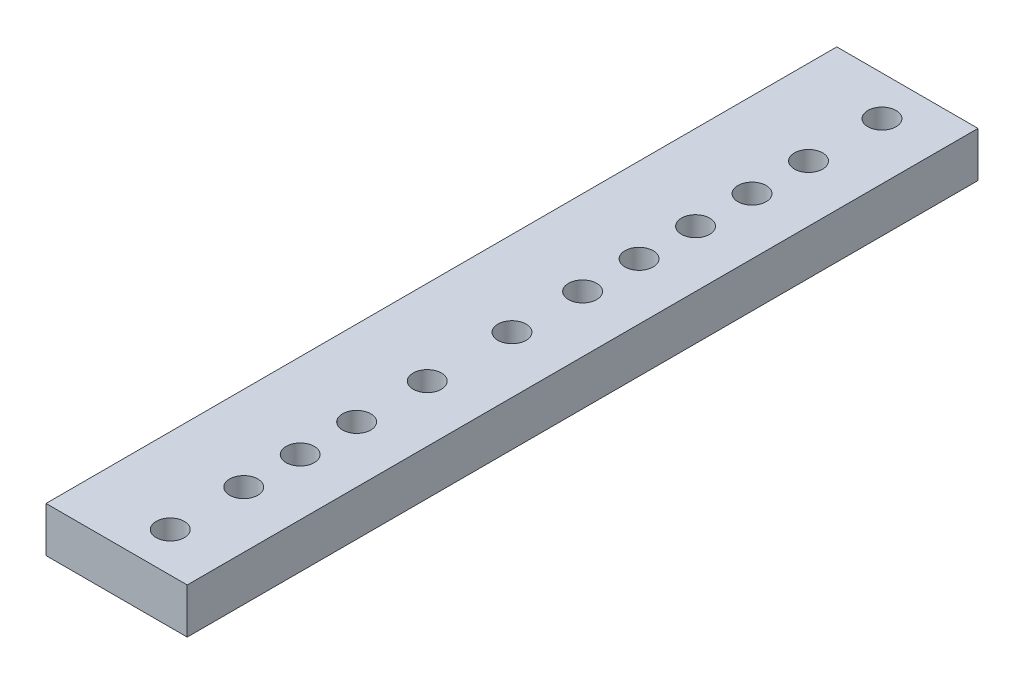
ISO-10303-21;
HEADER;
FILE_DESCRIPTION(('STEP AP214'),'2;1');
FILE_NAME('part.step','',(''),(''),'','','');
FILE_SCHEMA(('AUTOMOTIVE_DESIGN { 1 0 10303 214 1 1 1 1 }'));
ENDSEC;
DATA;
#1=APPLICATION_CONTEXT('core data for automotive mechanical design processes');
#2=APPLICATION_PROTOCOL_DEFINITION('international standard','automotive_design',2000,#1);
#3=PRODUCT_CONTEXT('',#1,'mechanical');
#4=PRODUCT('Part','Part','',(#3));
#5=PRODUCT_RELATED_PRODUCT_CATEGORY('part','',(#4));
#6=PRODUCT_DEFINITION_FORMATION('','',#4);
#7=PRODUCT_DEFINITION_CONTEXT('part definition',#1,'design');
#8=PRODUCT_DEFINITION('design','',#6,#7);
#9=PRODUCT_DEFINITION_SHAPE('','',#8);
#10=(LENGTH_UNIT() NAMED_UNIT(*) SI_UNIT(.MILLI.,.METRE.));
#11=(NAMED_UNIT(*) PLANE_ANGLE_UNIT() SI_UNIT($,.RADIAN.));
#12=(NAMED_UNIT(*) SI_UNIT($,.STERADIAN.) SOLID_ANGLE_UNIT());
#13=UNCERTAINTY_MEASURE_WITH_UNIT(LENGTH_MEASURE(1.E-05),#10,'distance_accuracy_value','');
#14=(GEOMETRIC_REPRESENTATION_CONTEXT(3) GLOBAL_UNCERTAINTY_ASSIGNED_CONTEXT((#13)) GLOBAL_UNIT_ASSIGNED_CONTEXT((#10,
#11,#12)) REPRESENTATION_CONTEXT('',''));
#15=CARTESIAN_POINT('',(0.,0.,0.));
#16=DIRECTION('',(0.,0.,1.));
#17=DIRECTION('',(1.,0.,0.));
#18=AXIS2_PLACEMENT_3D('',#15,#16,#17);
#19=CARTESIAN_POINT('',(0.,8.,0.));
#20=DIRECTION('',(1.,0.,0.));
#21=DIRECTION('',(0.,0.,-1.));
#22=AXIS2_PLACEMENT_3D('',#19,#20,#21);
#23=PLANE('',#22);
#24=DIRECTION('',(0.,0.,1.));
#25=VECTOR('',#24,1.);
#26=CARTESIAN_POINT('',(0.,0.,0.));
#27=LINE('',#26,#25);
#28=CARTESIAN_POINT('',(0.,0.,-140.));
#29=VERTEX_POINT('',#28);
#30=CARTESIAN_POINT('',(0.,0.,0.));
#31=VERTEX_POINT('',#30);
#32=EDGE_CURVE('E100',#29,#31,#27,.T.);
#33=ORIENTED_EDGE('',*,*,#32,.T.);
#34=DIRECTION('',(0.,-1.,0.));
#35=VECTOR('',#34,1.);
#36=CARTESIAN_POINT('',(0.,8.,0.));
#37=LINE('',#36,#35);
#38=CARTESIAN_POINT('',(0.,8.,0.));
#39=VERTEX_POINT('',#38);
#40=EDGE_CURVE('E11',#39,#31,#37,.T.);
#41=ORIENTED_EDGE('',*,*,#40,.F.);
#42=DIRECTION('',(0.,0.,1.));
#43=VECTOR('',#42,1.);
#44=CARTESIAN_POINT('',(0.,8.,0.));
#45=LINE('',#44,#43);
#46=CARTESIAN_POINT('',(0.,8.,-140.));
#47=VERTEX_POINT('',#46);
#48=EDGE_CURVE('E88',#47,#39,#45,.T.);
#49=ORIENTED_EDGE('',*,*,#48,.F.);
#50=DIRECTION('',(0.,-1.,0.));
#51=VECTOR('',#50,1.);
#52=CARTESIAN_POINT('',(0.,8.,-140.));
#53=LINE('',#52,#51);
#54=EDGE_CURVE('E96',#47,#29,#53,.T.);
#55=ORIENTED_EDGE('',*,*,#54,.T.);
#56=EDGE_LOOP('',(#33,#41,#49,#55));
#57=FACE_BOUND('',#56,.T.);
#58=ADVANCED_FACE('F37',(#57),#23,.F.);
#59=CARTESIAN_POINT('',(0.,8.,0.));
#60=DIRECTION('',(0.,0.,-1.));
#61=DIRECTION('',(-1.,0.,0.));
#62=AXIS2_PLACEMENT_3D('',#59,#60,#61);
#63=PLANE('',#62);
#64=DIRECTION('',(1.,0.,0.));
#65=VECTOR('',#64,1.);
#66=CARTESIAN_POINT('',(0.,0.,0.));
#67=LINE('',#66,#65);
#68=CARTESIAN_POINT('',(25.,0.,0.));
#69=VERTEX_POINT('',#68);
#70=EDGE_CURVE('E92',#31,#69,#67,.T.);
#71=ORIENTED_EDGE('',*,*,#70,.T.);
#72=DIRECTION('',(0.,-1.,0.));
#73=VECTOR('',#72,1.);
#74=CARTESIAN_POINT('',(25.,8.,0.));
#75=LINE('',#74,#73);
#76=CARTESIAN_POINT('',(25.,8.,0.));
#77=VERTEX_POINT('',#76);
#78=EDGE_CURVE('E45',#77,#69,#75,.T.);
#79=ORIENTED_EDGE('',*,*,#78,.F.);
#80=DIRECTION('',(1.,0.,0.));
#81=VECTOR('',#80,1.);
#82=CARTESIAN_POINT('',(0.,8.,0.));
#83=LINE('',#82,#81);
#84=EDGE_CURVE('E83',#39,#77,#83,.T.);
#85=ORIENTED_EDGE('',*,*,#84,.F.);
#86=ORIENTED_EDGE('',*,*,#40,.T.);
#87=EDGE_LOOP('',(#71,#79,#85,#86));
#88=FACE_BOUND('',#87,.T.);
#89=ADVANCED_FACE('F91',(#88),#63,.F.);
#90=CARTESIAN_POINT('',(25.,8.,0.));
#91=DIRECTION('',(-1.,0.,0.));
#92=DIRECTION('',(0.,0.,1.));
#93=AXIS2_PLACEMENT_3D('',#90,#91,#92);
#94=PLANE('',#93);
#95=DIRECTION('',(0.,0.,-1.));
#96=VECTOR('',#95,1.);
#97=CARTESIAN_POINT('',(25.,0.,0.));
#98=LINE('',#97,#96);
#99=CARTESIAN_POINT('',(25.,0.,-140.));
#100=VERTEX_POINT('',#99);
#101=EDGE_CURVE('E70',#69,#100,#98,.T.);
#102=ORIENTED_EDGE('',*,*,#101,.T.);
#103=DIRECTION('',(0.,-1.,0.));
#104=VECTOR('',#103,1.);
#105=CARTESIAN_POINT('',(25.,8.,-140.));
#106=LINE('',#105,#104);
#107=CARTESIAN_POINT('',(25.,8.,-140.));
#108=VERTEX_POINT('',#107);
#109=EDGE_CURVE('E93',#108,#100,#106,.T.);
#110=ORIENTED_EDGE('',*,*,#109,.F.);
#111=DIRECTION('',(0.,0.,-1.));
#112=VECTOR('',#111,1.);
#113=CARTESIAN_POINT('',(25.,8.,0.));
#114=LINE('',#113,#112);
#115=EDGE_CURVE('E86',#77,#108,#114,.T.);
#116=ORIENTED_EDGE('',*,*,#115,.F.);
#117=ORIENTED_EDGE('',*,*,#78,.T.);
#118=EDGE_LOOP('',(#102,#110,#116,#117));
#119=FACE_BOUND('',#118,.T.);
#120=ADVANCED_FACE('F94',(#119),#94,.F.);
#121=CARTESIAN_POINT('',(0.,8.,-140.));
#122=DIRECTION('',(0.,0.,1.));
#123=DIRECTION('',(1.,0.,0.));
#124=AXIS2_PLACEMENT_3D('',#121,#122,#123);
#125=PLANE('',#124);
#126=DIRECTION('',(-1.,0.,0.));
#127=VECTOR('',#126,1.);
#128=CARTESIAN_POINT('',(0.,0.,-140.));
#129=LINE('',#128,#127);
#130=EDGE_CURVE('E76',#100,#29,#129,.T.);
#131=ORIENTED_EDGE('',*,*,#130,.T.);
#132=ORIENTED_EDGE('',*,*,#54,.F.);
#133=DIRECTION('',(-1.,0.,0.));
#134=VECTOR('',#133,1.);
#135=CARTESIAN_POINT('',(0.,8.,-140.));
#136=LINE('',#135,#134);
#137=EDGE_CURVE('E53',#108,#47,#136,.T.);
#138=ORIENTED_EDGE('',*,*,#137,.F.);
#139=ORIENTED_EDGE('',*,*,#109,.T.);
#140=EDGE_LOOP('',(#131,#132,#138,#139));
#141=FACE_BOUND('',#140,.T.);
#142=ADVANCED_FACE('F108',(#141),#125,.F.);
#143=CARTESIAN_POINT('',(0.,8.,0.));
#144=DIRECTION('',(0.,-1.,0.));
#145=DIRECTION('',(0.,0.,-1.));
#146=AXIS2_PLACEMENT_3D('',#143,#144,#145);
#147=PLANE('',#146);
#148=CARTESIAN_POINT('',(14.998416969425,8.,-67.4999999164671));
#149=DIRECTION('',(0.,-1.,0.));
#150=DIRECTION('',(0.,0.,-1.));
#151=AXIS2_PLACEMENT_3D('',#148,#149,#150);
#152=CIRCLE('',#151,2.5);
#153=CARTESIAN_POINT('',(14.998416969425,8.,-69.9999999164671));
#154=VERTEX_POINT('',#153);
#155=EDGE_CURVE('E118',#154,#154,#152,.T.);
#156=ORIENTED_EDGE('',*,*,#155,.T.);
#157=EDGE_LOOP('',(#156));
#158=FACE_BOUND('',#157,.T.);
#159=CARTESIAN_POINT('',(14.997923513951,8.,-79.9999999067272));
#160=DIRECTION('',(0.,-1.,0.));
#161=DIRECTION('',(0.,0.,-1.));
#162=AXIS2_PLACEMENT_3D('',#159,#160,#161);
#163=CIRCLE('',#162,2.5);
#164=CARTESIAN_POINT('',(14.997923513951,8.,-82.4999999067272));
#165=VERTEX_POINT('',#164);
#166=EDGE_CURVE('E177',#165,#165,#163,.T.);
#167=ORIENTED_EDGE('',*,*,#166,.T.);
#168=EDGE_LOOP('',(#167));
#169=FACE_BOUND('',#168,.T.);
#170=CARTESIAN_POINT('',(14.9976450619615,8.,-89.9999999028504));
#171=DIRECTION('',(0.,-1.,0.));
#172=DIRECTION('',(0.,0.,-1.));
#173=AXIS2_PLACEMENT_3D('',#170,#171,#172);
#174=CIRCLE('',#173,2.5);
#175=CARTESIAN_POINT('',(14.9976450619615,8.,-92.4999999028504));
#176=VERTEX_POINT('',#175);
#177=EDGE_CURVE('E171',#176,#176,#174,.T.);
#178=ORIENTED_EDGE('',*,*,#177,.T.);
#179=EDGE_LOOP('',(#178));
#180=FACE_BOUND('',#179,.T.);
#181=CARTESIAN_POINT('',(14.9974952215144,8.,-99.9999999017278));
#182=DIRECTION('',(0.,-1.,0.));
#183=DIRECTION('',(0.,0.,-1.));
#184=AXIS2_PLACEMENT_3D('',#181,#182,#183);
#185=CIRCLE('',#184,2.5);
#186=CARTESIAN_POINT('',(14.9974952215144,8.,-102.499999901728));
#187=VERTEX_POINT('',#186);
#188=EDGE_CURVE('E165',#187,#187,#185,.T.);
#189=ORIENTED_EDGE('',*,*,#188,.T.);
#190=EDGE_LOOP('',(#189));
#191=FACE_BOUND('',#190,.T.);
#192=CARTESIAN_POINT('',(14.9973935200754,8.,-109.999999901211));
#193=DIRECTION('',(0.,-1.,0.));
#194=DIRECTION('',(0.,0.,-1.));
#195=AXIS2_PLACEMENT_3D('',#192,#193,#194);
#196=CIRCLE('',#195,2.5);
#197=CARTESIAN_POINT('',(14.9973935200754,8.,-112.499999901211));
#198=VERTEX_POINT('',#197);
#199=EDGE_CURVE('E159',#198,#198,#196,.T.);
#200=ORIENTED_EDGE('',*,*,#199,.T.);
#201=EDGE_LOOP('',(#200));
#202=FACE_BOUND('',#201,.T.);
#203=CARTESIAN_POINT('',(14.9973278386523,8.,-119.999999900995));
#204=DIRECTION('',(0.,-1.,0.));
#205=DIRECTION('',(0.,0.,-1.));
#206=AXIS2_PLACEMENT_3D('',#203,#204,#205);
#207=CIRCLE('',#206,2.5);
#208=CARTESIAN_POINT('',(14.9973278386523,8.,-122.499999900995));
#209=VERTEX_POINT('',#208);
#210=EDGE_CURVE('E153',#209,#209,#207,.T.);
#211=ORIENTED_EDGE('',*,*,#210,.T.);
#212=EDGE_LOOP('',(#211));
#213=FACE_BOUND('',#212,.T.);
#214=CARTESIAN_POINT('',(14.9972704033617,8.,-132.999999900868));
#215=DIRECTION('',(0.,-1.,0.));
#216=DIRECTION('',(0.,0.,-1.));
#217=AXIS2_PLACEMENT_3D('',#214,#215,#216);
#218=CIRCLE('',#217,2.5);
#219=CARTESIAN_POINT('',(14.9972704033617,8.,-135.499999900868));
#220=VERTEX_POINT('',#219);
#221=EDGE_CURVE('E147',#220,#220,#218,.T.);
#222=ORIENTED_EDGE('',*,*,#221,.T.);
#223=EDGE_LOOP('',(#222));
#224=FACE_BOUND('',#223,.T.);
#225=CARTESIAN_POINT('',(15.,8.,-7.00000000000001));
#226=DIRECTION('',(0.,1.,0.));
#227=DIRECTION('',(0.,0.,1.));
#228=AXIS2_PLACEMENT_3D('',#225,#226,#227);
#229=CIRCLE('',#228,2.5);
#230=CARTESIAN_POINT('',(15.,8.,-4.50000000000001));
#231=VERTEX_POINT('',#230);
#232=EDGE_CURVE('E139',#231,#231,#229,.T.);
#233=ORIENTED_EDGE('',*,*,#232,.F.);
#234=EDGE_LOOP('',(#233));
#235=FACE_BOUND('',#234,.T.);
#236=CARTESIAN_POINT('',(15.,8.,-20.));
#237=DIRECTION('',(0.,1.,0.));
#238=DIRECTION('',(0.,0.,1.));
#239=AXIS2_PLACEMENT_3D('',#236,#237,#238);
#240=CIRCLE('',#239,2.5);
#241=CARTESIAN_POINT('',(15.,8.,-17.5));
#242=VERTEX_POINT('',#241);
#243=EDGE_CURVE('E133',#242,#242,#240,.T.);
#244=ORIENTED_EDGE('',*,*,#243,.F.);
#245=EDGE_LOOP('',(#244));
#246=FACE_BOUND('',#245,.T.);
#247=CARTESIAN_POINT('',(15.,8.,-30.));
#248=DIRECTION('',(0.,1.,0.));
#249=DIRECTION('',(0.,0.,1.));
#250=AXIS2_PLACEMENT_3D('',#247,#248,#249);
#251=CIRCLE('',#250,2.5);
#252=CARTESIAN_POINT('',(15.,8.,-27.5));
#253=VERTEX_POINT('',#252);
#254=EDGE_CURVE('E127',#253,#253,#251,.T.);
#255=ORIENTED_EDGE('',*,*,#254,.F.);
#256=EDGE_LOOP('',(#255));
#257=FACE_BOUND('',#256,.T.);
#258=CARTESIAN_POINT('',(15.,8.,-40.));
#259=DIRECTION('',(0.,1.,0.));
#260=DIRECTION('',(0.,0.,1.));
#261=AXIS2_PLACEMENT_3D('',#258,#259,#260);
#262=CIRCLE('',#261,2.5);
#263=CARTESIAN_POINT('',(15.,8.,-37.5));
#264=VERTEX_POINT('',#263);
#265=EDGE_CURVE('E121',#264,#264,#262,.T.);
#266=ORIENTED_EDGE('',*,*,#265,.F.);
#267=EDGE_LOOP('',(#266));
#268=FACE_BOUND('',#267,.T.);
#269=CARTESIAN_POINT('',(15.,8.,-52.5));
#270=DIRECTION('',(0.,1.,0.));
#271=DIRECTION('',(0.,0.,1.));
#272=AXIS2_PLACEMENT_3D('',#269,#270,#271);
#273=CIRCLE('',#272,2.5);
#274=CARTESIAN_POINT('',(15.,8.,-50.));
#275=VERTEX_POINT('',#274);
#276=EDGE_CURVE('E114',#275,#275,#273,.T.);
#277=ORIENTED_EDGE('',*,*,#276,.F.);
#278=EDGE_LOOP('',(#277));
#279=FACE_BOUND('',#278,.T.);
#280=ORIENTED_EDGE('',*,*,#48,.T.);
#281=ORIENTED_EDGE('',*,*,#84,.T.);
#282=ORIENTED_EDGE('',*,*,#115,.T.);
#283=ORIENTED_EDGE('',*,*,#137,.T.);
#284=EDGE_LOOP('',(#280,#281,#282,#283));
#285=FACE_BOUND('',#284,.T.);
#286=ADVANCED_FACE('F84',(#158,#169,#180,#191,#202,#213,#224,#235,#246,#257,#268,#279,#285),
#147,.F.);
#287=CARTESIAN_POINT('',(0.,0.,0.));
#288=DIRECTION('',(0.,-1.,0.));
#289=DIRECTION('',(0.,0.,-1.));
#290=AXIS2_PLACEMENT_3D('',#287,#288,#289);
#291=PLANE('',#290);
#292=CARTESIAN_POINT('',(14.998416969425,0.,-67.4999999164671));
#293=DIRECTION('',(0.,-1.,0.));
#294=DIRECTION('',(0.,0.,-1.));
#295=AXIS2_PLACEMENT_3D('',#292,#293,#294);
#296=CIRCLE('',#295,2.5);
#297=CARTESIAN_POINT('',(14.998416969425,0.,-69.9999999164671));
#298=VERTEX_POINT('',#297);
#299=EDGE_CURVE('E180',#298,#298,#296,.T.);
#300=ORIENTED_EDGE('',*,*,#299,.F.);
#301=EDGE_LOOP('',(#300));
#302=FACE_BOUND('',#301,.T.);
#303=CARTESIAN_POINT('',(14.997923513951,0.,-79.9999999067272));
#304=DIRECTION('',(0.,-1.,0.));
#305=DIRECTION('',(0.,0.,-1.));
#306=AXIS2_PLACEMENT_3D('',#303,#304,#305);
#307=CIRCLE('',#306,2.5);
#308=CARTESIAN_POINT('',(14.997923513951,0.,-82.4999999067272));
#309=VERTEX_POINT('',#308);
#310=EDGE_CURVE('E174',#309,#309,#307,.T.);
#311=ORIENTED_EDGE('',*,*,#310,.F.);
#312=EDGE_LOOP('',(#311));
#313=FACE_BOUND('',#312,.T.);
#314=CARTESIAN_POINT('',(14.9976450619615,0.,-89.9999999028504));
#315=DIRECTION('',(0.,-1.,0.));
#316=DIRECTION('',(0.,0.,-1.));
#317=AXIS2_PLACEMENT_3D('',#314,#315,#316);
#318=CIRCLE('',#317,2.5);
#319=CARTESIAN_POINT('',(14.9976450619615,0.,-92.4999999028504));
#320=VERTEX_POINT('',#319);
#321=EDGE_CURVE('E168',#320,#320,#318,.T.);
#322=ORIENTED_EDGE('',*,*,#321,.F.);
#323=EDGE_LOOP('',(#322));
#324=FACE_BOUND('',#323,.T.);
#325=CARTESIAN_POINT('',(14.9974952215144,0.,-99.9999999017278));
#326=DIRECTION('',(0.,-1.,0.));
#327=DIRECTION('',(0.,0.,-1.));
#328=AXIS2_PLACEMENT_3D('',#325,#326,#327);
#329=CIRCLE('',#328,2.5);
#330=CARTESIAN_POINT('',(14.9974952215144,0.,-102.499999901728));
#331=VERTEX_POINT('',#330);
#332=EDGE_CURVE('E162',#331,#331,#329,.T.);
#333=ORIENTED_EDGE('',*,*,#332,.F.);
#334=EDGE_LOOP('',(#333));
#335=FACE_BOUND('',#334,.T.);
#336=CARTESIAN_POINT('',(14.9973935200754,0.,-109.999999901211));
#337=DIRECTION('',(0.,-1.,0.));
#338=DIRECTION('',(0.,0.,-1.));
#339=AXIS2_PLACEMENT_3D('',#336,#337,#338);
#340=CIRCLE('',#339,2.5);
#341=CARTESIAN_POINT('',(14.9973935200754,0.,-112.499999901211));
#342=VERTEX_POINT('',#341);
#343=EDGE_CURVE('E156',#342,#342,#340,.T.);
#344=ORIENTED_EDGE('',*,*,#343,.F.);
#345=EDGE_LOOP('',(#344));
#346=FACE_BOUND('',#345,.T.);
#347=CARTESIAN_POINT('',(14.9973278386523,0.,-119.999999900995));
#348=DIRECTION('',(0.,-1.,0.));
#349=DIRECTION('',(0.,0.,-1.));
#350=AXIS2_PLACEMENT_3D('',#347,#348,#349);
#351=CIRCLE('',#350,2.5);
#352=CARTESIAN_POINT('',(14.9973278386523,0.,-122.499999900995));
#353=VERTEX_POINT('',#352);
#354=EDGE_CURVE('E150',#353,#353,#351,.T.);
#355=ORIENTED_EDGE('',*,*,#354,.F.);
#356=EDGE_LOOP('',(#355));
#357=FACE_BOUND('',#356,.T.);
#358=CARTESIAN_POINT('',(14.9972704033617,0.,-132.999999900868));
#359=DIRECTION('',(0.,-1.,0.));
#360=DIRECTION('',(0.,0.,-1.));
#361=AXIS2_PLACEMENT_3D('',#358,#359,#360);
#362=CIRCLE('',#361,2.5);
#363=CARTESIAN_POINT('',(14.9972704033617,0.,-135.499999900868));
#364=VERTEX_POINT('',#363);
#365=EDGE_CURVE('E144',#364,#364,#362,.T.);
#366=ORIENTED_EDGE('',*,*,#365,.F.);
#367=EDGE_LOOP('',(#366));
#368=FACE_BOUND('',#367,.T.);
#369=CARTESIAN_POINT('',(15.,0.,-7.00000000000001));
#370=DIRECTION('',(0.,1.,0.));
#371=DIRECTION('',(0.,0.,1.));
#372=AXIS2_PLACEMENT_3D('',#369,#370,#371);
#373=CIRCLE('',#372,2.5);
#374=CARTESIAN_POINT('',(15.,0.,-4.50000000000001));
#375=VERTEX_POINT('',#374);
#376=EDGE_CURVE('E103',#375,#375,#373,.T.);
#377=ORIENTED_EDGE('',*,*,#376,.T.);
#378=EDGE_LOOP('',(#377));
#379=FACE_BOUND('',#378,.T.);
#380=CARTESIAN_POINT('',(15.,0.,-20.));
#381=DIRECTION('',(0.,1.,0.));
#382=DIRECTION('',(0.,0.,1.));
#383=AXIS2_PLACEMENT_3D('',#380,#381,#382);
#384=CIRCLE('',#383,2.5);
#385=CARTESIAN_POINT('',(15.,0.,-17.5));
#386=VERTEX_POINT('',#385);
#387=EDGE_CURVE('E136',#386,#386,#384,.T.);
#388=ORIENTED_EDGE('',*,*,#387,.T.);
#389=EDGE_LOOP('',(#388));
#390=FACE_BOUND('',#389,.T.);
#391=CARTESIAN_POINT('',(15.,0.,-30.));
#392=DIRECTION('',(0.,1.,0.));
#393=DIRECTION('',(0.,0.,1.));
#394=AXIS2_PLACEMENT_3D('',#391,#392,#393);
#395=CIRCLE('',#394,2.5);
#396=CARTESIAN_POINT('',(15.,0.,-27.5));
#397=VERTEX_POINT('',#396);
#398=EDGE_CURVE('E130',#397,#397,#395,.T.);
#399=ORIENTED_EDGE('',*,*,#398,.T.);
#400=EDGE_LOOP('',(#399));
#401=FACE_BOUND('',#400,.T.);
#402=CARTESIAN_POINT('',(15.,0.,-40.));
#403=DIRECTION('',(0.,1.,0.));
#404=DIRECTION('',(0.,0.,1.));
#405=AXIS2_PLACEMENT_3D('',#402,#403,#404);
#406=CIRCLE('',#405,2.5);
#407=CARTESIAN_POINT('',(15.,0.,-37.5));
#408=VERTEX_POINT('',#407);
#409=EDGE_CURVE('E124',#408,#408,#406,.T.);
#410=ORIENTED_EDGE('',*,*,#409,.T.);
#411=EDGE_LOOP('',(#410));
#412=FACE_BOUND('',#411,.T.);
#413=CARTESIAN_POINT('',(15.,0.,-52.5));
#414=DIRECTION('',(0.,1.,0.));
#415=DIRECTION('',(0.,0.,1.));
#416=AXIS2_PLACEMENT_3D('',#413,#414,#415);
#417=CIRCLE('',#416,2.5);
#418=CARTESIAN_POINT('',(15.,0.,-50.));
#419=VERTEX_POINT('',#418);
#420=EDGE_CURVE('E117',#419,#419,#417,.T.);
#421=ORIENTED_EDGE('',*,*,#420,.T.);
#422=EDGE_LOOP('',(#421));
#423=FACE_BOUND('',#422,.T.);
#424=ORIENTED_EDGE('',*,*,#32,.F.);
#425=ORIENTED_EDGE('',*,*,#130,.F.);
#426=ORIENTED_EDGE('',*,*,#101,.F.);
#427=ORIENTED_EDGE('',*,*,#70,.F.);
#428=EDGE_LOOP('',(#424,#425,#426,#427));
#429=FACE_BOUND('',#428,.T.);
#430=ADVANCED_FACE('F111',(#302,#313,#324,#335,#346,#357,#368,#379,#390,#401,#412,#423,#429),
#291,.T.);
#431=CARTESIAN_POINT('',(15.,0.,-52.5));
#432=DIRECTION('',(0.,1.,0.));
#433=DIRECTION('',(0.,0.,1.));
#434=AXIS2_PLACEMENT_3D('',#431,#432,#433);
#435=CYLINDRICAL_SURFACE('',#434,2.5);
#436=ORIENTED_EDGE('',*,*,#420,.F.);
#437=EDGE_LOOP('',(#436));
#438=FACE_BOUND('',#437,.T.);
#439=ORIENTED_EDGE('',*,*,#276,.T.);
#440=EDGE_LOOP('',(#439));
#441=FACE_BOUND('',#440,.T.);
#442=ADVANCED_FACE('F197',(#438,#441),#435,.F.);
#443=CARTESIAN_POINT('',(15.,0.,-40.));
#444=DIRECTION('',(0.,1.,0.));
#445=DIRECTION('',(0.,0.,1.));
#446=AXIS2_PLACEMENT_3D('',#443,#444,#445);
#447=CYLINDRICAL_SURFACE('',#446,2.5);
#448=ORIENTED_EDGE('',*,*,#409,.F.);
#449=EDGE_LOOP('',(#448));
#450=FACE_BOUND('',#449,.T.);
#451=ORIENTED_EDGE('',*,*,#265,.T.);
#452=EDGE_LOOP('',(#451));
#453=FACE_BOUND('',#452,.T.);
#454=ADVANCED_FACE('F223',(#450,#453),#447,.F.);
#455=CARTESIAN_POINT('',(15.,0.,-30.));
#456=DIRECTION('',(0.,1.,0.));
#457=DIRECTION('',(0.,0.,1.));
#458=AXIS2_PLACEMENT_3D('',#455,#456,#457);
#459=CYLINDRICAL_SURFACE('',#458,2.5);
#460=ORIENTED_EDGE('',*,*,#398,.F.);
#461=EDGE_LOOP('',(#460));
#462=FACE_BOUND('',#461,.T.);
#463=ORIENTED_EDGE('',*,*,#254,.T.);
#464=EDGE_LOOP('',(#463));
#465=FACE_BOUND('',#464,.T.);
#466=ADVANCED_FACE('F264',(#462,#465),#459,.F.);
#467=CARTESIAN_POINT('',(15.,0.,-20.));
#468=DIRECTION('',(0.,1.,0.));
#469=DIRECTION('',(0.,0.,1.));
#470=AXIS2_PLACEMENT_3D('',#467,#468,#469);
#471=CYLINDRICAL_SURFACE('',#470,2.5);
#472=ORIENTED_EDGE('',*,*,#387,.F.);
#473=EDGE_LOOP('',(#472));
#474=FACE_BOUND('',#473,.T.);
#475=ORIENTED_EDGE('',*,*,#243,.T.);
#476=EDGE_LOOP('',(#475));
#477=FACE_BOUND('',#476,.T.);
#478=ADVANCED_FACE('F274',(#474,#477),#471,.F.);
#479=CARTESIAN_POINT('',(15.,0.,-7.00000000000001));
#480=DIRECTION('',(0.,1.,0.));
#481=DIRECTION('',(0.,0.,1.));
#482=AXIS2_PLACEMENT_3D('',#479,#480,#481);
#483=CYLINDRICAL_SURFACE('',#482,2.5);
#484=ORIENTED_EDGE('',*,*,#376,.F.);
#485=EDGE_LOOP('',(#484));
#486=FACE_BOUND('',#485,.T.);
#487=ORIENTED_EDGE('',*,*,#232,.T.);
#488=EDGE_LOOP('',(#487));
#489=FACE_BOUND('',#488,.T.);
#490=ADVANCED_FACE('F284',(#486,#489),#483,.F.);
#491=CARTESIAN_POINT('',(14.9972704033617,8.,-132.999999900868));
#492=DIRECTION('',(0.,-1.,0.));
#493=DIRECTION('',(0.,0.,-1.));
#494=AXIS2_PLACEMENT_3D('',#491,#492,#493);
#495=CYLINDRICAL_SURFACE('',#494,2.5);
#496=ORIENTED_EDGE('',*,*,#221,.F.);
#497=EDGE_LOOP('',(#496));
#498=FACE_BOUND('',#497,.T.);
#499=ORIENTED_EDGE('',*,*,#365,.T.);
#500=EDGE_LOOP('',(#499));
#501=FACE_BOUND('',#500,.T.);
#502=ADVANCED_FACE('F293',(#498,#501),#495,.F.);
#503=CARTESIAN_POINT('',(14.9973278386523,8.,-119.999999900995));
#504=DIRECTION('',(0.,-1.,0.));
#505=DIRECTION('',(0.,0.,-1.));
#506=AXIS2_PLACEMENT_3D('',#503,#504,#505);
#507=CYLINDRICAL_SURFACE('',#506,2.5);
#508=ORIENTED_EDGE('',*,*,#210,.F.);
#509=EDGE_LOOP('',(#508));
#510=FACE_BOUND('',#509,.T.);
#511=ORIENTED_EDGE('',*,*,#354,.T.);
#512=EDGE_LOOP('',(#511));
#513=FACE_BOUND('',#512,.T.);
#514=ADVANCED_FACE('F312',(#510,#513),#507,.F.);
#515=CARTESIAN_POINT('',(14.9973935200754,8.,-109.999999901211));
#516=DIRECTION('',(0.,-1.,0.));
#517=DIRECTION('',(0.,0.,-1.));
#518=AXIS2_PLACEMENT_3D('',#515,#516,#517);
#519=CYLINDRICAL_SURFACE('',#518,2.5);
#520=ORIENTED_EDGE('',*,*,#199,.F.);
#521=EDGE_LOOP('',(#520));
#522=FACE_BOUND('',#521,.T.);
#523=ORIENTED_EDGE('',*,*,#343,.T.);
#524=EDGE_LOOP('',(#523));
#525=FACE_BOUND('',#524,.T.);
#526=ADVANCED_FACE('F322',(#522,#525),#519,.F.);
#527=CARTESIAN_POINT('',(14.9974952215144,8.,-99.9999999017278));
#528=DIRECTION('',(0.,-1.,0.));
#529=DIRECTION('',(0.,0.,-1.));
#530=AXIS2_PLACEMENT_3D('',#527,#528,#529);
#531=CYLINDRICAL_SURFACE('',#530,2.5);
#532=ORIENTED_EDGE('',*,*,#188,.F.);
#533=EDGE_LOOP('',(#532));
#534=FACE_BOUND('',#533,.T.);
#535=ORIENTED_EDGE('',*,*,#332,.T.);
#536=EDGE_LOOP('',(#535));
#537=FACE_BOUND('',#536,.T.);
#538=ADVANCED_FACE('F332',(#534,#537),#531,.F.);
#539=CARTESIAN_POINT('',(14.9976450619615,8.,-89.9999999028504));
#540=DIRECTION('',(0.,-1.,0.));
#541=DIRECTION('',(0.,0.,-1.));
#542=AXIS2_PLACEMENT_3D('',#539,#540,#541);
#543=CYLINDRICAL_SURFACE('',#542,2.5);
#544=ORIENTED_EDGE('',*,*,#177,.F.);
#545=EDGE_LOOP('',(#544));
#546=FACE_BOUND('',#545,.T.);
#547=ORIENTED_EDGE('',*,*,#321,.T.);
#548=EDGE_LOOP('',(#547));
#549=FACE_BOUND('',#548,.T.);
#550=ADVANCED_FACE('F342',(#546,#549),#543,.F.);
#551=CARTESIAN_POINT('',(14.997923513951,8.,-79.9999999067272));
#552=DIRECTION('',(0.,-1.,0.));
#553=DIRECTION('',(0.,0.,-1.));
#554=AXIS2_PLACEMENT_3D('',#551,#552,#553);
#555=CYLINDRICAL_SURFACE('',#554,2.5);
#556=ORIENTED_EDGE('',*,*,#166,.F.);
#557=EDGE_LOOP('',(#556));
#558=FACE_BOUND('',#557,.T.);
#559=ORIENTED_EDGE('',*,*,#310,.T.);
#560=EDGE_LOOP('',(#559));
#561=FACE_BOUND('',#560,.T.);
#562=ADVANCED_FACE('F191',(#558,#561),#555,.F.);
#563=CARTESIAN_POINT('',(14.998416969425,8.,-67.4999999164671));
#564=DIRECTION('',(0.,-1.,0.));
#565=DIRECTION('',(0.,0.,-1.));
#566=AXIS2_PLACEMENT_3D('',#563,#564,#565);
#567=CYLINDRICAL_SURFACE('',#566,2.5);
#568=ORIENTED_EDGE('',*,*,#155,.F.);
#569=EDGE_LOOP('',(#568));
#570=FACE_BOUND('',#569,.T.);
#571=ORIENTED_EDGE('',*,*,#299,.T.);
#572=EDGE_LOOP('',(#571));
#573=FACE_BOUND('',#572,.T.);
#574=ADVANCED_FACE('F188',(#570,#573),#567,.F.);
#575=CLOSED_SHELL('',(#58,#89,#120,#142,#286,#430,#442,#454,#466,#478,#490,#502,#514,#526,#538,
#550,#562,#574));
#576=MANIFOLD_SOLID_BREP('B2',#575);
#577=ADVANCED_BREP_SHAPE_REPRESENTATION('',(#18,#576),#14);
#578=SHAPE_DEFINITION_REPRESENTATION(#9,#577);
ENDSEC;
END-ISO-10303-21;
